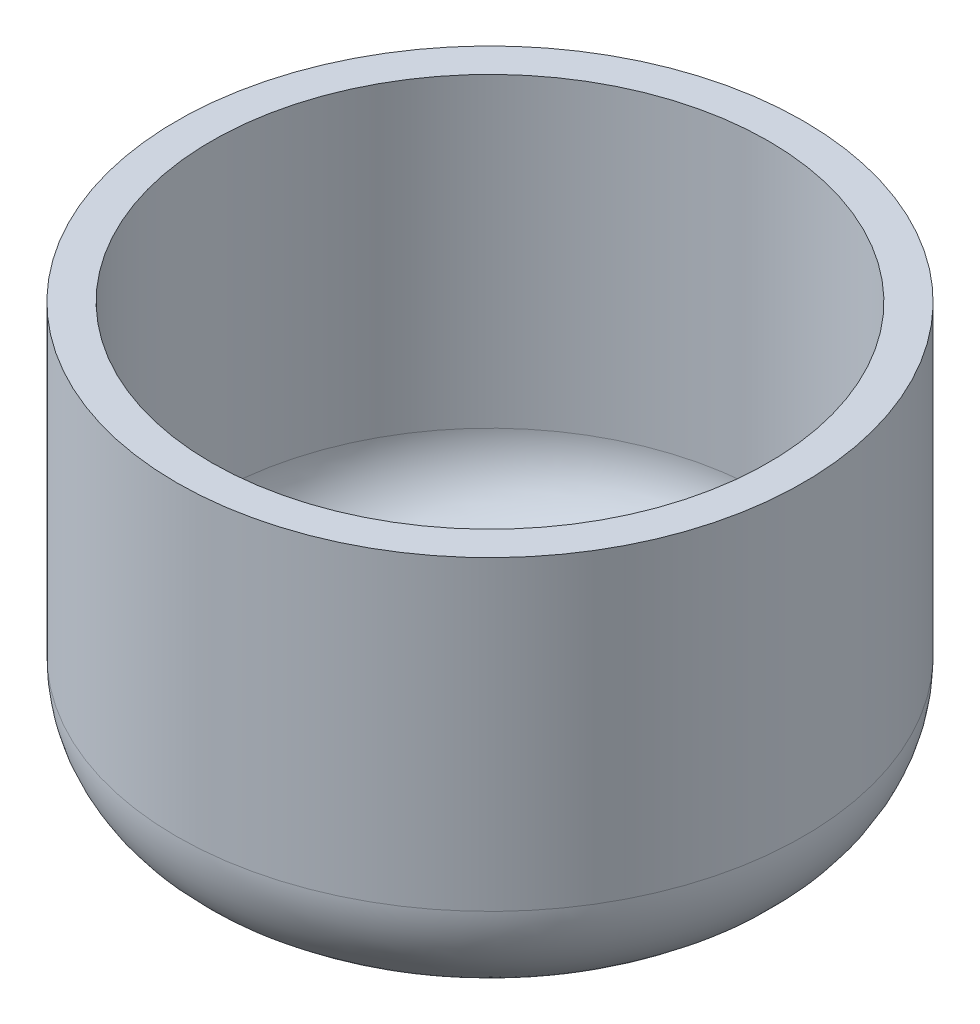
ISO-10303-21;
HEADER;
FILE_DESCRIPTION(('STEP AP214'),'2;1');
FILE_NAME('part.step','',(''),(''),'','','');
FILE_SCHEMA(('AUTOMOTIVE_DESIGN { 1 0 10303 214 1 1 1 1 }'));
ENDSEC;
DATA;
#1=APPLICATION_CONTEXT('core data for automotive mechanical design processes');
#2=APPLICATION_PROTOCOL_DEFINITION('international standard','automotive_design',2000,#1);
#3=PRODUCT_CONTEXT('',#1,'mechanical');
#4=PRODUCT('Part','Part','',(#3));
#5=PRODUCT_RELATED_PRODUCT_CATEGORY('part','',(#4));
#6=PRODUCT_DEFINITION_FORMATION('','',#4);
#7=PRODUCT_DEFINITION_CONTEXT('part definition',#1,'design');
#8=PRODUCT_DEFINITION('design','',#6,#7);
#9=PRODUCT_DEFINITION_SHAPE('','',#8);
#10=(LENGTH_UNIT() NAMED_UNIT(*) SI_UNIT(.MILLI.,.METRE.));
#11=(NAMED_UNIT(*) PLANE_ANGLE_UNIT() SI_UNIT($,.RADIAN.));
#12=(NAMED_UNIT(*) SI_UNIT($,.STERADIAN.) SOLID_ANGLE_UNIT());
#13=UNCERTAINTY_MEASURE_WITH_UNIT(LENGTH_MEASURE(1.E-05),#10,'distance_accuracy_value','');
#14=(GEOMETRIC_REPRESENTATION_CONTEXT(3) GLOBAL_UNCERTAINTY_ASSIGNED_CONTEXT((#13)) GLOBAL_UNIT_ASSIGNED_CONTEXT((#10,
#11,#12)) REPRESENTATION_CONTEXT('',''));
#15=CARTESIAN_POINT('',(0.,0.,0.));
#16=DIRECTION('',(0.,0.,1.));
#17=DIRECTION('',(1.,0.,0.));
#18=AXIS2_PLACEMENT_3D('',#15,#16,#17);
#19=CARTESIAN_POINT('',(0.,19.05,0.));
#20=DIRECTION('',(0.,-1.,0.));
#21=DIRECTION('',(0.,0.,-1.));
#22=AXIS2_PLACEMENT_3D('',#19,#20,#21);
#23=CYLINDRICAL_SURFACE('',#22,14.2875);
#24=CARTESIAN_POINT('',(0.,5.08,0.));
#25=DIRECTION('',(0.,1.,0.));
#26=DIRECTION('',(0.,0.,1.));
#27=AXIS2_PLACEMENT_3D('',#24,#25,#26);
#28=CIRCLE('',#27,14.2875);
#29=CARTESIAN_POINT('',(0.,5.08,-14.2875));
#30=VERTEX_POINT('',#29);
#31=EDGE_CURVE('E40',#30,#30,#28,.T.);
#32=CARTESIAN_POINT('',(0.,19.05,0.));
#33=DIRECTION('',(0.,1.,0.));
#34=DIRECTION('',(0.,0.,1.));
#35=AXIS2_PLACEMENT_3D('',#32,#33,#34);
#36=CIRCLE('',#35,14.2875);
#37=CARTESIAN_POINT('',(0.,19.05,-14.2875));
#38=VERTEX_POINT('',#37);
#39=EDGE_CURVE('E44',#38,#38,#36,.T.);
#40=CARTESIAN_POINT('',(0.,5.08,-14.2875));
#41=CARTESIAN_POINT('',(0.,5.22552083333333,-14.2875));
#42=CARTESIAN_POINT('',(0.,5.37104166666667,-14.2875));
#43=CARTESIAN_POINT('',(0.,5.66208333333333,-14.2875));
#44=CARTESIAN_POINT('',(0.,5.80760416666667,-14.2875));
#45=CARTESIAN_POINT('',(0.,6.09864583333333,-14.2875));
#46=CARTESIAN_POINT('',(0.,6.24416666666667,-14.2875));
#47=CARTESIAN_POINT('',(0.,6.53520833333333,-14.2875));
#48=CARTESIAN_POINT('',(0.,6.68072916666667,-14.2875));
#49=CARTESIAN_POINT('',(0.,6.97177083333333,-14.2875));
#50=CARTESIAN_POINT('',(0.,7.11729166666667,-14.2875));
#51=CARTESIAN_POINT('',(0.,7.40833333333333,-14.2875));
#52=CARTESIAN_POINT('',(0.,7.55385416666667,-14.2875));
#53=CARTESIAN_POINT('',(0.,7.84489583333333,-14.2875));
#54=CARTESIAN_POINT('',(0.,7.99041666666667,-14.2875));
#55=CARTESIAN_POINT('',(0.,8.28145833333333,-14.2875));
#56=CARTESIAN_POINT('',(0.,8.42697916666667,-14.2875));
#57=CARTESIAN_POINT('',(0.,8.71802083333333,-14.2875));
#58=CARTESIAN_POINT('',(0.,8.86354166666667,-14.2875));
#59=CARTESIAN_POINT('',(0.,9.15458333333333,-14.2875));
#60=CARTESIAN_POINT('',(0.,9.30010416666667,-14.2875));
#61=CARTESIAN_POINT('',(0.,9.59114583333333,-14.2875));
#62=CARTESIAN_POINT('',(0.,9.73666666666667,-14.2875));
#63=CARTESIAN_POINT('',(0.,10.0277083333333,-14.2875));
#64=CARTESIAN_POINT('',(0.,10.1732291666667,-14.2875));
#65=CARTESIAN_POINT('',(0.,10.4642708333333,-14.2875));
#66=CARTESIAN_POINT('',(0.,10.6097916666667,-14.2875));
#67=CARTESIAN_POINT('',(0.,10.9008333333333,-14.2875));
#68=CARTESIAN_POINT('',(0.,11.0463541666667,-14.2875));
#69=CARTESIAN_POINT('',(0.,11.3373958333333,-14.2875));
#70=CARTESIAN_POINT('',(0.,11.4829166666667,-14.2875));
#71=CARTESIAN_POINT('',(0.,11.7739583333333,-14.2875));
#72=CARTESIAN_POINT('',(0.,11.9194791666667,-14.2875));
#73=CARTESIAN_POINT('',(0.,12.2105208333333,-14.2875));
#74=CARTESIAN_POINT('',(0.,12.3560416666667,-14.2875));
#75=CARTESIAN_POINT('',(0.,12.6470833333333,-14.2875));
#76=CARTESIAN_POINT('',(0.,12.7926041666667,-14.2875));
#77=CARTESIAN_POINT('',(0.,13.0836458333333,-14.2875));
#78=CARTESIAN_POINT('',(0.,13.2291666666667,-14.2875));
#79=CARTESIAN_POINT('',(0.,13.5202083333333,-14.2875));
#80=CARTESIAN_POINT('',(0.,13.6657291666667,-14.2875));
#81=CARTESIAN_POINT('',(0.,13.9567708333333,-14.2875));
#82=CARTESIAN_POINT('',(0.,14.1022916666667,-14.2875));
#83=CARTESIAN_POINT('',(0.,14.3933333333333,-14.2875));
#84=CARTESIAN_POINT('',(0.,14.5388541666667,-14.2875));
#85=CARTESIAN_POINT('',(0.,14.8298958333333,-14.2875));
#86=CARTESIAN_POINT('',(0.,14.9754166666667,-14.2875));
#87=CARTESIAN_POINT('',(0.,15.2664583333333,-14.2875));
#88=CARTESIAN_POINT('',(0.,15.4119791666667,-14.2875));
#89=CARTESIAN_POINT('',(0.,15.7030208333333,-14.2875));
#90=CARTESIAN_POINT('',(0.,15.8485416666667,-14.2875));
#91=CARTESIAN_POINT('',(0.,16.1395833333333,-14.2875));
#92=CARTESIAN_POINT('',(0.,16.2851041666667,-14.2875));
#93=CARTESIAN_POINT('',(0.,16.5761458333333,-14.2875));
#94=CARTESIAN_POINT('',(0.,16.7216666666667,-14.2875));
#95=CARTESIAN_POINT('',(0.,17.0127083333333,-14.2875));
#96=CARTESIAN_POINT('',(0.,17.1582291666667,-14.2875));
#97=CARTESIAN_POINT('',(0.,17.4492708333333,-14.2875));
#98=CARTESIAN_POINT('',(0.,17.5947916666667,-14.2875));
#99=CARTESIAN_POINT('',(0.,17.8858333333333,-14.2875));
#100=CARTESIAN_POINT('',(0.,18.0313541666667,-14.2875));
#101=CARTESIAN_POINT('',(0.,18.3223958333333,-14.2875));
#102=CARTESIAN_POINT('',(0.,18.4679166666667,-14.2875));
#103=CARTESIAN_POINT('',(0.,18.7589583333333,-14.2875));
#104=CARTESIAN_POINT('',(0.,18.9044791666667,-14.2875));
#105=CARTESIAN_POINT('',(0.,19.05,-14.2875));
#106=B_SPLINE_CURVE_WITH_KNOTS('',3,(#40,#41,#42,#43,#44,#45,#46,#47,#48,#49,#50,#51,#52,#53,
#54,#55,#56,#57,#58,#59,#60,#61,#62,#63,#64,#65,#66,#67,#68,#69,#70,#71,#72,#73,#74,#75,#76,#77,
#78,#79,#80,#81,#82,#83,#84,#85,#86,#87,#88,#89,#90,#91,#92,#93,#94,#95,#96,#97,#98,#99,#100,
#101,#102,#103,#104,#105),.UNSPECIFIED.,.F.,.F.,(4,2,2,2,2,2,2,2,2,2,2,2,2,2,2,2,2,2,2,2,2,2,2,
2,2,2,2,2,2,2,2,2,4),(0.,0.436562499999999,0.873125000000001,1.3096875,1.74625,2.1828125,
2.619375,3.0559375,3.4925,3.9290625,4.365625,4.8021875,5.23875,5.6753125,6.111875,6.5484375,
6.985,7.4215625,7.858125,8.2946875,8.73125,9.1678125,9.604375,10.0409375,10.4775,10.9140625,
11.350625,11.7871875,12.22375,12.6603125,13.096875,13.5334375,13.97),.UNSPECIFIED.);
#107=EDGE_CURVE('BSEAM33',#30,#38,#106,.T.);
#108=ORIENTED_EDGE('',*,*,#31,.T.);
#109=ORIENTED_EDGE('',*,*,#39,.F.);
#110=ORIENTED_EDGE('',*,*,#107,.T.);
#111=ORIENTED_EDGE('',*,*,#107,.F.);
#112=EDGE_LOOP('',(#108,#110,#109,#111));
#113=FACE_BOUND('',#112,.T.);
#114=ADVANCED_FACE('F33',(#113),#23,.T.);
#115=CARTESIAN_POINT('',(0.,19.05,0.));
#116=DIRECTION('',(0.,1.,0.));
#117=DIRECTION('',(0.,0.,1.));
#118=AXIS2_PLACEMENT_3D('',#115,#116,#117);
#119=PLANE('',#118);
#120=CARTESIAN_POINT('',(0.,19.05,0.));
#121=DIRECTION('',(0.,1.,0.));
#122=DIRECTION('',(0.,0.,1.));
#123=AXIS2_PLACEMENT_3D('',#120,#121,#122);
#124=CIRCLE('',#123,12.7);
#125=CARTESIAN_POINT('',(0.,19.05,-12.7));
#126=VERTEX_POINT('',#125);
#127=EDGE_CURVE('E51',#126,#126,#124,.T.);
#128=ORIENTED_EDGE('',*,*,#127,.F.);
#129=EDGE_LOOP('',(#128));
#130=FACE_BOUND('',#129,.T.);
#131=ORIENTED_EDGE('',*,*,#39,.T.);
#132=EDGE_LOOP('',(#131));
#133=FACE_BOUND('',#132,.T.);
#134=ADVANCED_FACE('F87',(#130,#133),#119,.T.);
#135=CARTESIAN_POINT('',(0.,0.,0.));
#136=DIRECTION('',(0.,1.,0.));
#137=DIRECTION('',(0.,0.,1.));
#138=AXIS2_PLACEMENT_3D('',#135,#136,#137);
#139=PLANE('',#138);
#140=CARTESIAN_POINT('',(0.,0.,0.));
#141=DIRECTION('',(0.,1.,0.));
#142=DIRECTION('',(0.,0.,1.));
#143=AXIS2_PLACEMENT_3D('',#140,#141,#142);
#144=CIRCLE('',#143,2.2479);
#145=CARTESIAN_POINT('',(0.,0.,2.2479));
#146=VERTEX_POINT('',#145);
#147=EDGE_CURVE('E55',#146,#146,#144,.T.);
#148=ORIENTED_EDGE('',*,*,#147,.T.);
#149=EDGE_LOOP('',(#148));
#150=FACE_BOUND('',#149,.T.);
#151=CARTESIAN_POINT('',(0.,0.,0.));
#152=DIRECTION('',(0.,1.,0.));
#153=DIRECTION('',(0.,0.,1.));
#154=AXIS2_PLACEMENT_3D('',#151,#152,#153);
#155=CIRCLE('',#154,9.2075);
#156=CARTESIAN_POINT('',(0.,0.,9.2075));
#157=VERTEX_POINT('',#156);
#158=EDGE_CURVE('E10',#157,#157,#155,.F.);
#159=ORIENTED_EDGE('',*,*,#158,.T.);
#160=EDGE_LOOP('',(#159));
#161=FACE_BOUND('',#160,.T.);
#162=ADVANCED_FACE('F90',(#150,#161),#139,.F.);
#163=CARTESIAN_POINT('',(0.,5.08,0.));
#164=DIRECTION('',(0.,1.,0.));
#165=DIRECTION('',(0.,0.,1.));
#166=AXIS2_PLACEMENT_3D('',#163,#164,#165);
#167=TOROIDAL_SURFACE('',#166,9.2075,5.08);
#168=ORIENTED_EDGE('',*,*,#158,.F.);
#169=EDGE_LOOP('',(#168));
#170=FACE_BOUND('',#169,.T.);
#171=ORIENTED_EDGE('',*,*,#31,.F.);
#172=EDGE_LOOP('',(#171));
#173=FACE_BOUND('',#172,.T.);
#174=ADVANCED_FACE('F35',(#170,#173),#167,.T.);
#175=CARTESIAN_POINT('',(0.,19.05,0.));
#176=DIRECTION('',(0.,-1.,0.));
#177=DIRECTION('',(0.,0.,-1.));
#178=AXIS2_PLACEMENT_3D('',#175,#176,#177);
#179=CYLINDRICAL_SURFACE('',#178,12.7);
#180=CARTESIAN_POINT('',(0.,5.08,0.));
#181=DIRECTION('',(0.,-1.,0.));
#182=DIRECTION('',(0.,0.,-1.));
#183=AXIS2_PLACEMENT_3D('',#180,#181,#182);
#184=CIRCLE('',#183,12.7);
#185=CARTESIAN_POINT('',(0.,5.08,-12.7));
#186=VERTEX_POINT('',#185);
#187=EDGE_CURVE('E54',#186,#186,#184,.F.);
#188=CARTESIAN_POINT('',(0.,5.08,-12.7));
#189=CARTESIAN_POINT('',(0.,5.22552083333334,-12.7));
#190=CARTESIAN_POINT('',(0.,5.37104166666667,-12.7));
#191=CARTESIAN_POINT('',(0.,5.66208333333334,-12.7));
#192=CARTESIAN_POINT('',(0.,5.80760416666667,-12.7));
#193=CARTESIAN_POINT('',(0.,6.09864583333334,-12.7));
#194=CARTESIAN_POINT('',(0.,6.24416666666667,-12.7));
#195=CARTESIAN_POINT('',(0.,6.53520833333334,-12.7));
#196=CARTESIAN_POINT('',(0.,6.68072916666667,-12.7));
#197=CARTESIAN_POINT('',(0.,6.97177083333334,-12.7));
#198=CARTESIAN_POINT('',(0.,7.11729166666667,-12.7));
#199=CARTESIAN_POINT('',(0.,7.40833333333333,-12.7));
#200=CARTESIAN_POINT('',(0.,7.55385416666667,-12.7));
#201=CARTESIAN_POINT('',(0.,7.84489583333334,-12.7));
#202=CARTESIAN_POINT('',(0.,7.99041666666667,-12.7));
#203=CARTESIAN_POINT('',(0.,8.28145833333333,-12.7));
#204=CARTESIAN_POINT('',(0.,8.42697916666667,-12.7));
#205=CARTESIAN_POINT('',(0.,8.71802083333334,-12.7));
#206=CARTESIAN_POINT('',(0.,8.86354166666667,-12.7));
#207=CARTESIAN_POINT('',(0.,9.15458333333334,-12.7));
#208=CARTESIAN_POINT('',(0.,9.30010416666667,-12.7));
#209=CARTESIAN_POINT('',(0.,9.59114583333334,-12.7));
#210=CARTESIAN_POINT('',(0.,9.73666666666667,-12.7));
#211=CARTESIAN_POINT('',(0.,10.0277083333333,-12.7));
#212=CARTESIAN_POINT('',(0.,10.1732291666667,-12.7));
#213=CARTESIAN_POINT('',(0.,10.4642708333333,-12.7));
#214=CARTESIAN_POINT('',(0.,10.6097916666667,-12.7));
#215=CARTESIAN_POINT('',(0.,10.9008333333333,-12.7));
#216=CARTESIAN_POINT('',(0.,11.0463541666667,-12.7));
#217=CARTESIAN_POINT('',(0.,11.3373958333333,-12.7));
#218=CARTESIAN_POINT('',(0.,11.4829166666667,-12.7));
#219=CARTESIAN_POINT('',(0.,11.7739583333333,-12.7));
#220=CARTESIAN_POINT('',(0.,11.9194791666667,-12.7));
#221=CARTESIAN_POINT('',(0.,12.2105208333333,-12.7));
#222=CARTESIAN_POINT('',(0.,12.3560416666667,-12.7));
#223=CARTESIAN_POINT('',(0.,12.6470833333333,-12.7));
#224=CARTESIAN_POINT('',(0.,12.7926041666667,-12.7));
#225=CARTESIAN_POINT('',(0.,13.0836458333333,-12.7));
#226=CARTESIAN_POINT('',(0.,13.2291666666667,-12.7));
#227=CARTESIAN_POINT('',(0.,13.5202083333333,-12.7));
#228=CARTESIAN_POINT('',(0.,13.6657291666667,-12.7));
#229=CARTESIAN_POINT('',(0.,13.9567708333333,-12.7));
#230=CARTESIAN_POINT('',(0.,14.1022916666667,-12.7));
#231=CARTESIAN_POINT('',(0.,14.3933333333333,-12.7));
#232=CARTESIAN_POINT('',(0.,14.5388541666667,-12.7));
#233=CARTESIAN_POINT('',(0.,14.8298958333333,-12.7));
#234=CARTESIAN_POINT('',(0.,14.9754166666667,-12.7));
#235=CARTESIAN_POINT('',(0.,15.2664583333333,-12.7));
#236=CARTESIAN_POINT('',(0.,15.4119791666667,-12.7));
#237=CARTESIAN_POINT('',(0.,15.7030208333333,-12.7));
#238=CARTESIAN_POINT('',(0.,15.8485416666667,-12.7));
#239=CARTESIAN_POINT('',(0.,16.1395833333333,-12.7));
#240=CARTESIAN_POINT('',(0.,16.2851041666667,-12.7));
#241=CARTESIAN_POINT('',(0.,16.5761458333333,-12.7));
#242=CARTESIAN_POINT('',(0.,16.7216666666667,-12.7));
#243=CARTESIAN_POINT('',(0.,17.0127083333333,-12.7));
#244=CARTESIAN_POINT('',(0.,17.1582291666667,-12.7));
#245=CARTESIAN_POINT('',(0.,17.4492708333333,-12.7));
#246=CARTESIAN_POINT('',(0.,17.5947916666667,-12.7));
#247=CARTESIAN_POINT('',(0.,17.8858333333333,-12.7));
#248=CARTESIAN_POINT('',(0.,18.0313541666667,-12.7));
#249=CARTESIAN_POINT('',(0.,18.3223958333333,-12.7));
#250=CARTESIAN_POINT('',(0.,18.4679166666667,-12.7));
#251=CARTESIAN_POINT('',(0.,18.7589583333333,-12.7));
#252=CARTESIAN_POINT('',(0.,18.9044791666667,-12.7));
#253=CARTESIAN_POINT('',(0.,19.05,-12.7));
#254=B_SPLINE_CURVE_WITH_KNOTS('',3,(#188,#189,#190,#191,#192,#193,#194,#195,#196,#197,#198,
#199,#200,#201,#202,#203,#204,#205,#206,#207,#208,#209,#210,#211,#212,#213,#214,#215,#216,#217,
#218,#219,#220,#221,#222,#223,#224,#225,#226,#227,#228,#229,#230,#231,#232,#233,#234,#235,#236,
#237,#238,#239,#240,#241,#242,#243,#244,#245,#246,#247,#248,#249,#250,#251,#252,#253),
.UNSPECIFIED.,.F.,.F.,(4,2,2,2,2,2,2,2,2,2,2,2,2,2,2,2,2,2,2,2,2,2,2,2,2,2,2,2,2,2,2,2,4),(0.,
0.436562499999999,0.873125000000001,1.3096875,1.74625,2.1828125,2.619375,3.0559375,3.4925,
3.9290625,4.365625,4.8021875,5.23875,5.6753125,6.111875,6.5484375,6.985,7.4215625,7.858125,
8.2946875,8.73125,9.1678125,9.604375,10.0409375,10.4775,10.9140625,11.350625,11.7871875,
12.22375,12.6603125,13.096875,13.5334375,13.97),.UNSPECIFIED.);
#255=EDGE_CURVE('BSEAM73',#186,#126,#254,.T.);
#256=ORIENTED_EDGE('',*,*,#187,.F.);
#257=ORIENTED_EDGE('',*,*,#127,.T.);
#258=ORIENTED_EDGE('',*,*,#255,.T.);
#259=ORIENTED_EDGE('',*,*,#255,.F.);
#260=EDGE_LOOP('',(#256,#258,#257,#259));
#261=FACE_BOUND('',#260,.T.);
#262=ADVANCED_FACE('F73',(#261),#179,.F.);
#263=CARTESIAN_POINT('',(0.,1.5875,0.));
#264=DIRECTION('',(0.,1.,0.));
#265=DIRECTION('',(0.,0.,1.));
#266=AXIS2_PLACEMENT_3D('',#263,#264,#265);
#267=PLANE('',#266);
#268=CARTESIAN_POINT('',(0.,1.5875,0.));
#269=DIRECTION('',(0.,1.,0.));
#270=DIRECTION('',(0.,0.,1.));
#271=AXIS2_PLACEMENT_3D('',#268,#269,#270);
#272=CIRCLE('',#271,2.2479);
#273=CARTESIAN_POINT('',(0.,1.5875,2.2479));
#274=VERTEX_POINT('',#273);
#275=EDGE_CURVE('E62',#274,#274,#272,.T.);
#276=ORIENTED_EDGE('',*,*,#275,.F.);
#277=EDGE_LOOP('',(#276));
#278=FACE_BOUND('',#277,.T.);
#279=CARTESIAN_POINT('',(0.,1.5875,0.));
#280=DIRECTION('',(0.,1.,0.));
#281=DIRECTION('',(0.,0.,1.));
#282=AXIS2_PLACEMENT_3D('',#279,#280,#281);
#283=CIRCLE('',#282,9.2075);
#284=CARTESIAN_POINT('',(0.,1.5875,9.2075));
#285=VERTEX_POINT('',#284);
#286=EDGE_CURVE('E48',#285,#285,#283,.F.);
#287=ORIENTED_EDGE('',*,*,#286,.F.);
#288=EDGE_LOOP('',(#287));
#289=FACE_BOUND('',#288,.T.);
#290=ADVANCED_FACE('F69',(#278,#289),#267,.T.);
#291=CARTESIAN_POINT('',(0.,5.08,0.));
#292=DIRECTION('',(0.,1.,0.));
#293=DIRECTION('',(0.,0.,1.));
#294=AXIS2_PLACEMENT_3D('',#291,#292,#293);
#295=TOROIDAL_SURFACE('',#294,9.2075,3.4925);
#296=ORIENTED_EDGE('',*,*,#286,.T.);
#297=EDGE_LOOP('',(#296));
#298=FACE_BOUND('',#297,.T.);
#299=ORIENTED_EDGE('',*,*,#187,.T.);
#300=EDGE_LOOP('',(#299));
#301=FACE_BOUND('',#300,.T.);
#302=ADVANCED_FACE('F72',(#298,#301),#295,.F.);
#303=CARTESIAN_POINT('',(0.,1.5875,0.));
#304=DIRECTION('',(0.,1.,0.));
#305=DIRECTION('',(0.,0.,1.));
#306=AXIS2_PLACEMENT_3D('',#303,#304,#305);
#307=CYLINDRICAL_SURFACE('',#306,2.2479);
#308=ORIENTED_EDGE('',*,*,#275,.T.);
#309=EDGE_LOOP('',(#308));
#310=FACE_BOUND('',#309,.T.);
#311=ORIENTED_EDGE('',*,*,#147,.F.);
#312=EDGE_LOOP('',(#311));
#313=FACE_BOUND('',#312,.T.);
#314=ADVANCED_FACE('F66',(#310,#313),#307,.F.);
#315=CLOSED_SHELL('',(#114,#134,#162,#174,#262,#290,#302,#314));
#316=MANIFOLD_SOLID_BREP('B2',#315);
#317=ADVANCED_BREP_SHAPE_REPRESENTATION('',(#18,#316),#14);
#318=SHAPE_DEFINITION_REPRESENTATION(#9,#317);
ENDSEC;
END-ISO-10303-21;
